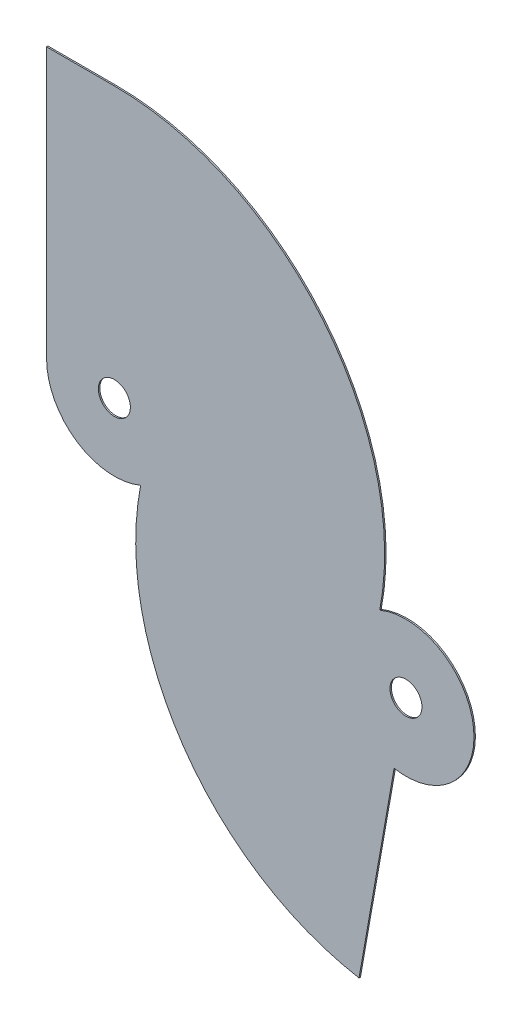
ISO-10303-21;
HEADER;
FILE_DESCRIPTION(('STEP AP214'),'2;1');
FILE_NAME('part.step','',(''),(''),'','','');
FILE_SCHEMA(('AUTOMOTIVE_DESIGN { 1 0 10303 214 1 1 1 1 }'));
ENDSEC;
DATA;
#1=APPLICATION_CONTEXT('core data for automotive mechanical design processes');
#2=APPLICATION_PROTOCOL_DEFINITION('international standard','automotive_design',2000,#1);
#3=PRODUCT_CONTEXT('',#1,'mechanical');
#4=PRODUCT('Part','Part','',(#3));
#5=PRODUCT_RELATED_PRODUCT_CATEGORY('part','',(#4));
#6=PRODUCT_DEFINITION_FORMATION('','',#4);
#7=PRODUCT_DEFINITION_CONTEXT('part definition',#1,'design');
#8=PRODUCT_DEFINITION('design','',#6,#7);
#9=PRODUCT_DEFINITION_SHAPE('','',#8);
#10=(LENGTH_UNIT() NAMED_UNIT(*) SI_UNIT(.MILLI.,.METRE.));
#11=(NAMED_UNIT(*) PLANE_ANGLE_UNIT() SI_UNIT($,.RADIAN.));
#12=(NAMED_UNIT(*) SI_UNIT($,.STERADIAN.) SOLID_ANGLE_UNIT());
#13=UNCERTAINTY_MEASURE_WITH_UNIT(LENGTH_MEASURE(1.E-05),#10,'distance_accuracy_value','');
#14=(GEOMETRIC_REPRESENTATION_CONTEXT(3) GLOBAL_UNCERTAINTY_ASSIGNED_CONTEXT((#13)) GLOBAL_UNIT_ASSIGNED_CONTEXT((#10,
#11,#12)) REPRESENTATION_CONTEXT('',''));
#15=CARTESIAN_POINT('',(0.,0.,0.));
#16=DIRECTION('',(0.,0.,1.));
#17=DIRECTION('',(1.,0.,0.));
#18=AXIS2_PLACEMENT_3D('',#15,#16,#17);
#19=CARTESIAN_POINT('',(0.,0.,1.27));
#20=DIRECTION('',(0.,0.,-1.));
#21=DIRECTION('',(-1.,0.,0.));
#22=AXIS2_PLACEMENT_3D('',#19,#20,#21);
#23=PLANE('',#22);
#24=CARTESIAN_POINT('',(82.55,355.6,1.27));
#25=DIRECTION('',(0.,0.,-1.));
#26=DIRECTION('',(-1.,0.,0.));
#27=AXIS2_PLACEMENT_3D('',#24,#25,#26);
#28=CIRCLE('',#27,14.2875);
#29=CARTESIAN_POINT('',(68.2625,355.6,1.27));
#30=VERTEX_POINT('',#29);
#31=EDGE_CURVE('E12',#30,#30,#28,.T.);
#32=ORIENTED_EDGE('',*,*,#31,.T.);
#33=EDGE_LOOP('',(#32));
#34=FACE_BOUND('',#33,.T.);
#35=CARTESIAN_POINT('',(342.9,254.,1.27));
#36=DIRECTION('',(0.,0.,-1.));
#37=DIRECTION('',(-1.,0.,0.));
#38=AXIS2_PLACEMENT_3D('',#35,#36,#37);
#39=CIRCLE('',#38,14.2875);
#40=CARTESIAN_POINT('',(328.6125,254.,1.27));
#41=VERTEX_POINT('',#40);
#42=EDGE_CURVE('E149',#41,#41,#39,.T.);
#43=ORIENTED_EDGE('',*,*,#42,.T.);
#44=EDGE_LOOP('',(#43));
#45=FACE_BOUND('',#44,.T.);
#46=CARTESIAN_POINT('',(342.9,254.,1.27));
#47=DIRECTION('',(0.,0.,-1.));
#48=DIRECTION('',(-1.,0.,0.));
#49=AXIS2_PLACEMENT_3D('',#46,#47,#48);
#50=CIRCLE('',#49,241.3);
#51=CARTESIAN_POINT('',(300.998694728969,16.3658891981543,1.27));
#52=VERTEX_POINT('',#51);
#53=CARTESIAN_POINT('',(105.98760735489,299.806202758677,1.27));
#54=VERTEX_POINT('',#53);
#55=EDGE_CURVE('E146',#52,#54,#50,.T.);
#56=ORIENTED_EDGE('',*,*,#55,.F.);
#57=DIRECTION('',(-0.173648177666933,-0.984807753012208,0.));
#58=VECTOR('',#57,1.);
#59=CARTESIAN_POINT('',(289.123741631383,-50.980316412997,1.27));
#60=LINE('',#59,#58);
#61=CARTESIAN_POINT('',(332.352291021623,194.180969832314,1.27));
#62=VERTEX_POINT('',#61);
#63=EDGE_CURVE('E144',#62,#52,#60,.T.);
#64=ORIENTED_EDGE('',*,*,#63,.F.);
#65=CARTESIAN_POINT('',(342.9,254.,1.27));
#66=DIRECTION('',(0.,0.,-1.));
#67=DIRECTION('',(-1.,0.,0.));
#68=AXIS2_PLACEMENT_3D('',#65,#66,#67);
#69=CIRCLE('',#68,60.741835129465);
#70=CARTESIAN_POINT('',(319.513573184935,310.059304095919,1.27));
#71=VERTEX_POINT('',#70);
#72=EDGE_CURVE('E142',#71,#62,#69,.T.);
#73=ORIENTED_EDGE('',*,*,#72,.F.);
#74=CARTESIAN_POINT('',(82.55,355.6,1.27));
#75=DIRECTION('',(0.,0.,-1.));
#76=DIRECTION('',(-1.,0.,0.));
#77=AXIS2_PLACEMENT_3D('',#74,#75,#76);
#78=CIRCLE('',#77,241.3);
#79=CARTESIAN_POINT('',(82.3088917157141,596.899879541609,1.27));
#80=VERTEX_POINT('',#79);
#81=EDGE_CURVE('E140',#80,#71,#78,.T.);
#82=ORIENTED_EDGE('',*,*,#81,.F.);
#83=DIRECTION('',(1.,0.,0.));
#84=VECTOR('',#83,1.);
#85=CARTESIAN_POINT('',(0.,596.899879541609,1.27));
#86=LINE('',#85,#84);
#87=CARTESIAN_POINT('',(22.0333142916122,596.899879541609,1.27));
#88=VERTEX_POINT('',#87);
#89=EDGE_CURVE('E138',#88,#80,#86,.T.);
#90=ORIENTED_EDGE('',*,*,#89,.F.);
#91=DIRECTION('',(0.,1.,0.));
#92=VECTOR('',#91,1.);
#93=CARTESIAN_POINT('',(22.0333142916121,0.,1.27));
#94=LINE('',#93,#92);
#95=CARTESIAN_POINT('',(22.0333142916121,355.6,1.27));
#96=VERTEX_POINT('',#95);
#97=EDGE_CURVE('E96',#96,#88,#94,.T.);
#98=ORIENTED_EDGE('',*,*,#97,.F.);
#99=CARTESIAN_POINT('',(82.55,355.6,1.27));
#100=DIRECTION('',(0.,0.,-1.));
#101=DIRECTION('',(-1.,0.,0.));
#102=AXIS2_PLACEMENT_3D('',#99,#100,#101);
#103=CIRCLE('',#102,60.5166857083879);
#104=EDGE_CURVE('E128',#54,#96,#103,.T.);
#105=ORIENTED_EDGE('',*,*,#104,.F.);
#106=EDGE_LOOP('',(#56,#64,#73,#82,#90,#98,#105));
#107=FACE_BOUND('',#106,.T.);
#108=ADVANCED_FACE('F34',(#34,#45,#107),#23,.F.);
#109=CARTESIAN_POINT('',(0.,0.,0.));
#110=DIRECTION('',(0.,0.,-1.));
#111=DIRECTION('',(-1.,0.,0.));
#112=AXIS2_PLACEMENT_3D('',#109,#110,#111);
#113=PLANE('',#112);
#114=CARTESIAN_POINT('',(82.55,355.6,0.));
#115=DIRECTION('',(0.,0.,-1.));
#116=DIRECTION('',(-1.,0.,0.));
#117=AXIS2_PLACEMENT_3D('',#114,#115,#116);
#118=CIRCLE('',#117,14.2875);
#119=CARTESIAN_POINT('',(68.2625,355.6,0.));
#120=VERTEX_POINT('',#119);
#121=EDGE_CURVE('E38',#120,#120,#118,.T.);
#122=ORIENTED_EDGE('',*,*,#121,.F.);
#123=EDGE_LOOP('',(#122));
#124=FACE_BOUND('',#123,.T.);
#125=CARTESIAN_POINT('',(342.9,254.,0.));
#126=DIRECTION('',(0.,0.,-1.));
#127=DIRECTION('',(-1.,0.,0.));
#128=AXIS2_PLACEMENT_3D('',#125,#126,#127);
#129=CIRCLE('',#128,14.2875);
#130=CARTESIAN_POINT('',(328.6125,254.,0.));
#131=VERTEX_POINT('',#130);
#132=EDGE_CURVE('E148',#131,#131,#129,.T.);
#133=ORIENTED_EDGE('',*,*,#132,.F.);
#134=EDGE_LOOP('',(#133));
#135=FACE_BOUND('',#134,.T.);
#136=DIRECTION('',(-0.173648177666933,-0.984807753012207,0.));
#137=VECTOR('',#136,1.);
#138=CARTESIAN_POINT('',(332.352291021623,194.180969832314,0.));
#139=LINE('',#138,#137);
#140=CARTESIAN_POINT('',(332.352291021623,194.180969832314,0.));
#141=VERTEX_POINT('',#140);
#142=CARTESIAN_POINT('',(300.998694728969,16.3658891981543,0.));
#143=VERTEX_POINT('',#142);
#144=EDGE_CURVE('E124',#141,#143,#139,.T.);
#145=ORIENTED_EDGE('',*,*,#144,.T.);
#146=CARTESIAN_POINT('',(342.9,254.,0.));
#147=DIRECTION('',(0.,0.,-1.));
#148=DIRECTION('',(1.,0.,0.));
#149=AXIS2_PLACEMENT_3D('',#146,#147,#148);
#150=CIRCLE('',#149,241.3);
#151=CARTESIAN_POINT('',(105.98760735489,299.806202758677,0.));
#152=VERTEX_POINT('',#151);
#153=EDGE_CURVE('E116',#143,#152,#150,.T.);
#154=ORIENTED_EDGE('',*,*,#153,.T.);
#155=CARTESIAN_POINT('',(82.55,355.6,0.));
#156=DIRECTION('',(0.,0.,-1.));
#157=DIRECTION('',(-1.,0.,0.));
#158=AXIS2_PLACEMENT_3D('',#155,#156,#157);
#159=CIRCLE('',#158,60.5166857083879);
#160=CARTESIAN_POINT('',(22.0333142916121,355.6,0.));
#161=VERTEX_POINT('',#160);
#162=EDGE_CURVE('E114',#152,#161,#159,.T.);
#163=ORIENTED_EDGE('',*,*,#162,.T.);
#164=DIRECTION('',(0.,1.,0.));
#165=VECTOR('',#164,1.);
#166=CARTESIAN_POINT('',(22.0333142916121,355.6,0.));
#167=LINE('',#166,#165);
#168=CARTESIAN_POINT('',(22.0333142916122,596.899879541609,0.));
#169=VERTEX_POINT('',#168);
#170=EDGE_CURVE('E57',#161,#169,#167,.T.);
#171=ORIENTED_EDGE('',*,*,#170,.T.);
#172=DIRECTION('',(1.,0.,0.));
#173=VECTOR('',#172,1.);
#174=CARTESIAN_POINT('',(22.0333142916122,596.899879541609,0.));
#175=LINE('',#174,#173);
#176=CARTESIAN_POINT('',(82.3088917157141,596.899879541609,0.));
#177=VERTEX_POINT('',#176);
#178=EDGE_CURVE('E103',#169,#177,#175,.T.);
#179=ORIENTED_EDGE('',*,*,#178,.T.);
#180=CARTESIAN_POINT('',(82.55,355.6,0.));
#181=DIRECTION('',(0.,0.,-1.));
#182=DIRECTION('',(1.,0.,0.));
#183=AXIS2_PLACEMENT_3D('',#180,#181,#182);
#184=CIRCLE('',#183,241.3);
#185=CARTESIAN_POINT('',(319.513573184935,310.059304095919,0.));
#186=VERTEX_POINT('',#185);
#187=EDGE_CURVE('E109',#177,#186,#184,.T.);
#188=ORIENTED_EDGE('',*,*,#187,.T.);
#189=CARTESIAN_POINT('',(342.9,254.,0.));
#190=DIRECTION('',(0.,0.,-1.));
#191=DIRECTION('',(-1.,0.,0.));
#192=AXIS2_PLACEMENT_3D('',#189,#190,#191);
#193=CIRCLE('',#192,60.741835129465);
#194=EDGE_CURVE('E121',#186,#141,#193,.T.);
#195=ORIENTED_EDGE('',*,*,#194,.T.);
#196=EDGE_LOOP('',(#145,#154,#163,#171,#179,#188,#195));
#197=FACE_BOUND('',#196,.T.);
#198=ADVANCED_FACE('F36',(#124,#135,#197),#113,.T.);
#199=CARTESIAN_POINT('',(82.55,355.6,1.27));
#200=DIRECTION('',(0.,0.,-1.));
#201=DIRECTION('',(-1.,0.,0.));
#202=AXIS2_PLACEMENT_3D('',#199,#200,#201);
#203=CYLINDRICAL_SURFACE('',#202,14.2875);
#204=ORIENTED_EDGE('',*,*,#31,.F.);
#205=EDGE_LOOP('',(#204));
#206=FACE_BOUND('',#205,.T.);
#207=ORIENTED_EDGE('',*,*,#121,.T.);
#208=EDGE_LOOP('',(#207));
#209=FACE_BOUND('',#208,.T.);
#210=ADVANCED_FACE('F158',(#206,#209),#203,.F.);
#211=CARTESIAN_POINT('',(342.9,254.,1.27));
#212=DIRECTION('',(0.,0.,-1.));
#213=DIRECTION('',(-1.,0.,0.));
#214=AXIS2_PLACEMENT_3D('',#211,#212,#213);
#215=CYLINDRICAL_SURFACE('',#214,14.2875);
#216=ORIENTED_EDGE('',*,*,#42,.F.);
#217=EDGE_LOOP('',(#216));
#218=FACE_BOUND('',#217,.T.);
#219=ORIENTED_EDGE('',*,*,#132,.T.);
#220=EDGE_LOOP('',(#219));
#221=FACE_BOUND('',#220,.T.);
#222=ADVANCED_FACE('F155',(#218,#221),#215,.F.);
#223=CARTESIAN_POINT('',(342.9,254.,2.54));
#224=DIRECTION('',(0.,0.,-1.));
#225=DIRECTION('',(-1.,0.,0.));
#226=AXIS2_PLACEMENT_3D('',#223,#224,#225);
#227=CYLINDRICAL_SURFACE('',#226,241.3);
#228=ORIENTED_EDGE('',*,*,#55,.T.);
#229=DIRECTION('',(0.,0.,-1.));
#230=VECTOR('',#229,1.);
#231=CARTESIAN_POINT('',(105.98760735489,299.806202758677,2.54));
#232=LINE('',#231,#230);
#233=EDGE_CURVE('E49',#54,#152,#232,.T.);
#234=ORIENTED_EDGE('',*,*,#233,.T.);
#235=ORIENTED_EDGE('',*,*,#153,.F.);
#236=DIRECTION('',(0.,0.,-1.));
#237=VECTOR('',#236,1.);
#238=CARTESIAN_POINT('',(300.998694728969,16.3658891981543,2.54));
#239=LINE('',#238,#237);
#240=EDGE_CURVE('E126',#52,#143,#239,.T.);
#241=ORIENTED_EDGE('',*,*,#240,.F.);
#242=EDGE_LOOP('',(#228,#234,#235,#241));
#243=FACE_BOUND('',#242,.T.);
#244=ADVANCED_FACE('F176',(#243),#227,.T.);
#245=CARTESIAN_POINT('',(332.352291021623,194.180969832314,2.54));
#246=DIRECTION('',(0.984807753012207,-0.173648177666933,0.));
#247=DIRECTION('',(0.173648177666933,0.984807753012208,0.));
#248=AXIS2_PLACEMENT_3D('',#245,#246,#247);
#249=PLANE('',#248);
#250=ORIENTED_EDGE('',*,*,#63,.T.);
#251=ORIENTED_EDGE('',*,*,#240,.T.);
#252=ORIENTED_EDGE('',*,*,#144,.F.);
#253=DIRECTION('',(0.,0.,-1.));
#254=VECTOR('',#253,1.);
#255=CARTESIAN_POINT('',(332.352291021623,194.180969832314,2.54));
#256=LINE('',#255,#254);
#257=EDGE_CURVE('E129',#62,#141,#256,.T.);
#258=ORIENTED_EDGE('',*,*,#257,.F.);
#259=EDGE_LOOP('',(#250,#251,#252,#258));
#260=FACE_BOUND('',#259,.T.);
#261=ADVANCED_FACE('F180',(#260),#249,.T.);
#262=CARTESIAN_POINT('',(342.9,254.,2.54));
#263=DIRECTION('',(0.,0.,-1.));
#264=DIRECTION('',(-1.,0.,0.));
#265=AXIS2_PLACEMENT_3D('',#262,#263,#264);
#266=CYLINDRICAL_SURFACE('',#265,60.741835129465);
#267=ORIENTED_EDGE('',*,*,#72,.T.);
#268=ORIENTED_EDGE('',*,*,#257,.T.);
#269=ORIENTED_EDGE('',*,*,#194,.F.);
#270=DIRECTION('',(0.,0.,-1.));
#271=VECTOR('',#270,1.);
#272=CARTESIAN_POINT('',(319.513573184935,310.059304095919,2.54));
#273=LINE('',#272,#271);
#274=EDGE_CURVE('E131',#71,#186,#273,.T.);
#275=ORIENTED_EDGE('',*,*,#274,.F.);
#276=EDGE_LOOP('',(#267,#268,#269,#275));
#277=FACE_BOUND('',#276,.T.);
#278=ADVANCED_FACE('F192',(#277),#266,.T.);
#279=CARTESIAN_POINT('',(82.55,355.6,2.54));
#280=DIRECTION('',(0.,0.,-1.));
#281=DIRECTION('',(-1.,0.,0.));
#282=AXIS2_PLACEMENT_3D('',#279,#280,#281);
#283=CYLINDRICAL_SURFACE('',#282,241.3);
#284=ORIENTED_EDGE('',*,*,#81,.T.);
#285=ORIENTED_EDGE('',*,*,#274,.T.);
#286=ORIENTED_EDGE('',*,*,#187,.F.);
#287=DIRECTION('',(0.,0.,-1.));
#288=VECTOR('',#287,1.);
#289=CARTESIAN_POINT('',(82.3088917157141,596.899879541609,2.54));
#290=LINE('',#289,#288);
#291=EDGE_CURVE('E99',#80,#177,#290,.T.);
#292=ORIENTED_EDGE('',*,*,#291,.F.);
#293=EDGE_LOOP('',(#284,#285,#286,#292));
#294=FACE_BOUND('',#293,.T.);
#295=ADVANCED_FACE('F189',(#294),#283,.T.);
#296=CARTESIAN_POINT('',(22.0333142916122,596.899879541609,2.54));
#297=DIRECTION('',(0.,1.,0.));
#298=DIRECTION('',(0.,0.,1.));
#299=AXIS2_PLACEMENT_3D('',#296,#297,#298);
#300=PLANE('',#299);
#301=ORIENTED_EDGE('',*,*,#89,.T.);
#302=ORIENTED_EDGE('',*,*,#291,.T.);
#303=ORIENTED_EDGE('',*,*,#178,.F.);
#304=DIRECTION('',(0.,0.,-1.));
#305=VECTOR('',#304,1.);
#306=CARTESIAN_POINT('',(22.0333142916122,596.899879541609,2.54));
#307=LINE('',#306,#305);
#308=EDGE_CURVE('E92',#88,#169,#307,.T.);
#309=ORIENTED_EDGE('',*,*,#308,.F.);
#310=EDGE_LOOP('',(#301,#302,#303,#309));
#311=FACE_BOUND('',#310,.T.);
#312=ADVANCED_FACE('F104',(#311),#300,.T.);
#313=CARTESIAN_POINT('',(22.0333142916121,355.6,2.54));
#314=DIRECTION('',(-1.,0.,0.));
#315=DIRECTION('',(0.,-1.,0.));
#316=AXIS2_PLACEMENT_3D('',#313,#314,#315);
#317=PLANE('',#316);
#318=ORIENTED_EDGE('',*,*,#97,.T.);
#319=ORIENTED_EDGE('',*,*,#308,.T.);
#320=ORIENTED_EDGE('',*,*,#170,.F.);
#321=DIRECTION('',(0.,0.,-1.));
#322=VECTOR('',#321,1.);
#323=CARTESIAN_POINT('',(22.0333142916121,355.6,2.54));
#324=LINE('',#323,#322);
#325=EDGE_CURVE('E100',#96,#161,#324,.T.);
#326=ORIENTED_EDGE('',*,*,#325,.F.);
#327=EDGE_LOOP('',(#318,#319,#320,#326));
#328=FACE_BOUND('',#327,.T.);
#329=ADVANCED_FACE('F94',(#328),#317,.T.);
#330=CARTESIAN_POINT('',(82.55,355.6,2.54));
#331=DIRECTION('',(0.,0.,-1.));
#332=DIRECTION('',(-1.,0.,0.));
#333=AXIS2_PLACEMENT_3D('',#330,#331,#332);
#334=CYLINDRICAL_SURFACE('',#333,60.5166857083879);
#335=ORIENTED_EDGE('',*,*,#104,.T.);
#336=ORIENTED_EDGE('',*,*,#325,.T.);
#337=ORIENTED_EDGE('',*,*,#162,.F.);
#338=ORIENTED_EDGE('',*,*,#233,.F.);
#339=EDGE_LOOP('',(#335,#336,#337,#338));
#340=FACE_BOUND('',#339,.T.);
#341=ADVANCED_FACE('F182',(#340),#334,.T.);
#342=CLOSED_SHELL('',(#108,#198,#210,#222,#244,#261,#278,#295,#312,#329,#341));
#343=MANIFOLD_SOLID_BREP('B2',#342);
#344=ADVANCED_BREP_SHAPE_REPRESENTATION('',(#18,#343),#14);
#345=SHAPE_DEFINITION_REPRESENTATION(#9,#344);
ENDSEC;
END-ISO-10303-21;
